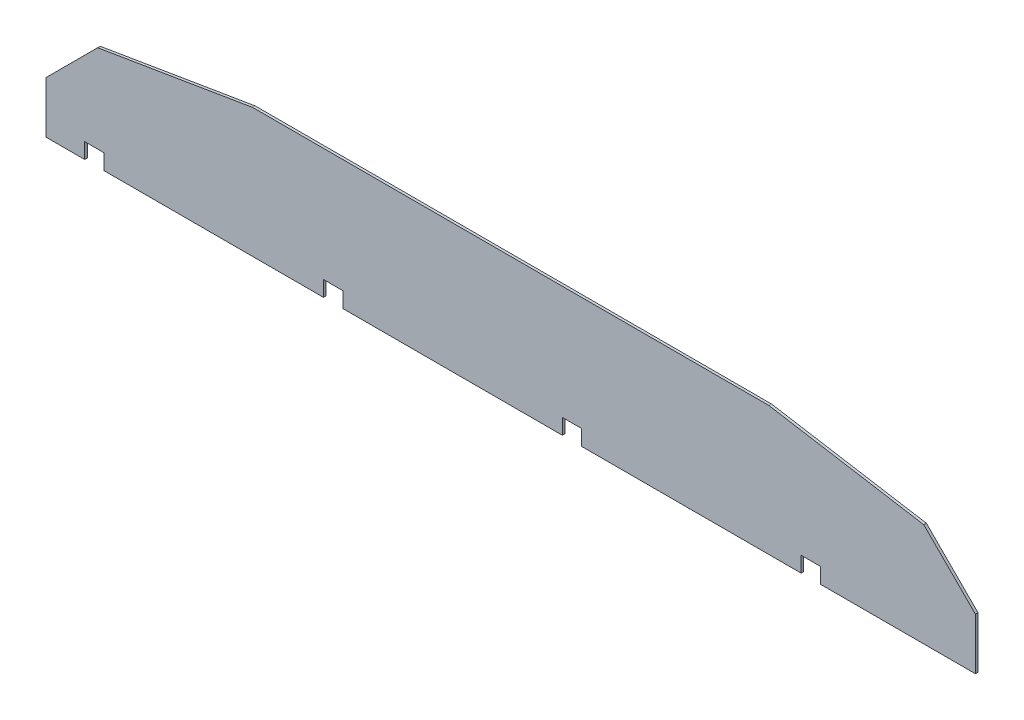
ISO-10303-21;
HEADER;
FILE_DESCRIPTION(('STEP AP214'),'2;1');
FILE_NAME('part.step','',(''),(''),'','','');
FILE_SCHEMA(('AUTOMOTIVE_DESIGN { 1 0 10303 214 1 1 1 1 }'));
ENDSEC;
DATA;
#1=APPLICATION_CONTEXT('core data for automotive mechanical design processes');
#2=APPLICATION_PROTOCOL_DEFINITION('international standard','automotive_design',2000,#1);
#3=PRODUCT_CONTEXT('',#1,'mechanical');
#4=PRODUCT('Part','Part','',(#3));
#5=PRODUCT_RELATED_PRODUCT_CATEGORY('part','',(#4));
#6=PRODUCT_DEFINITION_FORMATION('','',#4);
#7=PRODUCT_DEFINITION_CONTEXT('part definition',#1,'design');
#8=PRODUCT_DEFINITION('design','',#6,#7);
#9=PRODUCT_DEFINITION_SHAPE('','',#8);
#10=(LENGTH_UNIT() NAMED_UNIT(*) SI_UNIT(.MILLI.,.METRE.));
#11=(NAMED_UNIT(*) PLANE_ANGLE_UNIT() SI_UNIT($,.RADIAN.));
#12=(NAMED_UNIT(*) SI_UNIT($,.STERADIAN.) SOLID_ANGLE_UNIT());
#13=UNCERTAINTY_MEASURE_WITH_UNIT(LENGTH_MEASURE(1.E-05),#10,'distance_accuracy_value','');
#14=(GEOMETRIC_REPRESENTATION_CONTEXT(3) GLOBAL_UNCERTAINTY_ASSIGNED_CONTEXT((#13)) GLOBAL_UNIT_ASSIGNED_CONTEXT((#10,
#11,#12)) REPRESENTATION_CONTEXT('',''));
#15=CARTESIAN_POINT('',(0.,0.,0.));
#16=DIRECTION('',(0.,0.,1.));
#17=DIRECTION('',(1.,0.,0.));
#18=AXIS2_PLACEMENT_3D('',#15,#16,#17);
#19=CARTESIAN_POINT('',(-720.,40.,2.));
#20=DIRECTION('',(1.,0.,0.));
#21=DIRECTION('',(0.,0.,-1.));
#22=AXIS2_PLACEMENT_3D('',#19,#20,#21);
#23=PLANE('',#22);
#24=DIRECTION('',(0.,-1.,0.));
#25=VECTOR('',#24,1.);
#26=CARTESIAN_POINT('',(-720.,40.,0.));
#27=LINE('',#26,#25);
#28=CARTESIAN_POINT('',(-720.,40.,0.));
#29=VERTEX_POINT('',#28);
#30=CARTESIAN_POINT('',(-720.,0.,0.));
#31=VERTEX_POINT('',#30);
#32=EDGE_CURVE('E229',#29,#31,#27,.T.);
#33=ORIENTED_EDGE('',*,*,#32,.T.);
#34=DIRECTION('',(0.,0.,-1.));
#35=VECTOR('',#34,1.);
#36=CARTESIAN_POINT('',(-720.,0.,2.));
#37=LINE('',#36,#35);
#38=CARTESIAN_POINT('',(-720.,0.,2.));
#39=VERTEX_POINT('',#38);
#40=EDGE_CURVE('E11',#39,#31,#37,.T.);
#41=ORIENTED_EDGE('',*,*,#40,.F.);
#42=DIRECTION('',(0.,-1.,0.));
#43=VECTOR('',#42,1.);
#44=CARTESIAN_POINT('',(-720.,40.,2.));
#45=LINE('',#44,#43);
#46=CARTESIAN_POINT('',(-720.,40.,2.));
#47=VERTEX_POINT('',#46);
#48=EDGE_CURVE('E275',#47,#39,#45,.T.);
#49=ORIENTED_EDGE('',*,*,#48,.F.);
#50=DIRECTION('',(0.,0.,-1.));
#51=VECTOR('',#50,1.);
#52=CARTESIAN_POINT('',(-720.,40.,2.));
#53=LINE('',#52,#51);
#54=EDGE_CURVE('E225',#47,#29,#53,.T.);
#55=ORIENTED_EDGE('',*,*,#54,.T.);
#56=EDGE_LOOP('',(#33,#41,#49,#55));
#57=FACE_BOUND('',#56,.T.);
#58=ADVANCED_FACE('F37',(#57),#23,.F.);
#59=CARTESIAN_POINT('',(-720.,0.,2.));
#60=DIRECTION('',(0.,1.,0.));
#61=DIRECTION('',(-1.,0.,0.));
#62=AXIS2_PLACEMENT_3D('',#59,#60,#61);
#63=PLANE('',#62);
#64=DIRECTION('',(1.,0.,0.));
#65=VECTOR('',#64,1.);
#66=CARTESIAN_POINT('',(-720.,0.,0.));
#67=LINE('',#66,#65);
#68=CARTESIAN_POINT('',(-690.,0.,0.));
#69=VERTEX_POINT('',#68);
#70=EDGE_CURVE('E232',#31,#69,#67,.T.);
#71=ORIENTED_EDGE('',*,*,#70,.T.);
#72=DIRECTION('',(0.,0.,-1.));
#73=VECTOR('',#72,1.);
#74=CARTESIAN_POINT('',(-690.,0.,2.));
#75=LINE('',#74,#73);
#76=CARTESIAN_POINT('',(-690.,0.,2.));
#77=VERTEX_POINT('',#76);
#78=EDGE_CURVE('E45',#77,#69,#75,.T.);
#79=ORIENTED_EDGE('',*,*,#78,.F.);
#80=DIRECTION('',(1.,0.,0.));
#81=VECTOR('',#80,1.);
#82=CARTESIAN_POINT('',(-720.,0.,2.));
#83=LINE('',#82,#81);
#84=EDGE_CURVE('E144',#39,#77,#83,.T.);
#85=ORIENTED_EDGE('',*,*,#84,.F.);
#86=ORIENTED_EDGE('',*,*,#40,.T.);
#87=EDGE_LOOP('',(#71,#79,#85,#86));
#88=FACE_BOUND('',#87,.T.);
#89=ADVANCED_FACE('F413',(#88),#63,.F.);
#90=CARTESIAN_POINT('',(-690.,0.,2.));
#91=DIRECTION('',(-1.,0.,0.));
#92=DIRECTION('',(0.,0.,1.));
#93=AXIS2_PLACEMENT_3D('',#90,#91,#92);
#94=PLANE('',#93);
#95=DIRECTION('',(0.,1.,0.));
#96=VECTOR('',#95,1.);
#97=CARTESIAN_POINT('',(-690.,0.,0.));
#98=LINE('',#97,#96);
#99=CARTESIAN_POINT('',(-690.,12.,0.));
#100=VERTEX_POINT('',#99);
#101=EDGE_CURVE('E234',#69,#100,#98,.T.);
#102=ORIENTED_EDGE('',*,*,#101,.T.);
#103=DIRECTION('',(0.,0.,-1.));
#104=VECTOR('',#103,1.);
#105=CARTESIAN_POINT('',(-690.,12.,2.));
#106=LINE('',#105,#104);
#107=CARTESIAN_POINT('',(-690.,12.,2.));
#108=VERTEX_POINT('',#107);
#109=EDGE_CURVE('E330',#108,#100,#106,.T.);
#110=ORIENTED_EDGE('',*,*,#109,.F.);
#111=DIRECTION('',(0.,1.,0.));
#112=VECTOR('',#111,1.);
#113=CARTESIAN_POINT('',(-690.,0.,2.));
#114=LINE('',#113,#112);
#115=EDGE_CURVE('E338',#77,#108,#114,.T.);
#116=ORIENTED_EDGE('',*,*,#115,.F.);
#117=ORIENTED_EDGE('',*,*,#78,.T.);
#118=EDGE_LOOP('',(#102,#110,#116,#117));
#119=FACE_BOUND('',#118,.T.);
#120=ADVANCED_FACE('F336',(#119),#94,.F.);
#121=CARTESIAN_POINT('',(-690.,12.,2.));
#122=DIRECTION('',(0.,1.,0.));
#123=DIRECTION('',(-1.,0.,0.));
#124=AXIS2_PLACEMENT_3D('',#121,#122,#123);
#125=PLANE('',#124);
#126=DIRECTION('',(1.,0.,0.));
#127=VECTOR('',#126,1.);
#128=CARTESIAN_POINT('',(-690.,12.,0.));
#129=LINE('',#128,#127);
#130=CARTESIAN_POINT('',(-675.,12.,0.));
#131=VERTEX_POINT('',#130);
#132=EDGE_CURVE('E236',#100,#131,#129,.T.);
#133=ORIENTED_EDGE('',*,*,#132,.T.);
#134=DIRECTION('',(0.,0.,-1.));
#135=VECTOR('',#134,1.);
#136=CARTESIAN_POINT('',(-675.,12.,2.));
#137=LINE('',#136,#135);
#138=CARTESIAN_POINT('',(-675.,12.,2.));
#139=VERTEX_POINT('',#138);
#140=EDGE_CURVE('E327',#139,#131,#137,.T.);
#141=ORIENTED_EDGE('',*,*,#140,.F.);
#142=DIRECTION('',(1.,0.,0.));
#143=VECTOR('',#142,1.);
#144=CARTESIAN_POINT('',(-690.,12.,2.));
#145=LINE('',#144,#143);
#146=EDGE_CURVE('E356',#108,#139,#145,.T.);
#147=ORIENTED_EDGE('',*,*,#146,.F.);
#148=ORIENTED_EDGE('',*,*,#109,.T.);
#149=EDGE_LOOP('',(#133,#141,#147,#148));
#150=FACE_BOUND('',#149,.T.);
#151=ADVANCED_FACE('F347',(#150),#125,.F.);
#152=CARTESIAN_POINT('',(-675.,12.,2.));
#153=DIRECTION('',(1.,0.,0.));
#154=DIRECTION('',(0.,0.,-1.));
#155=AXIS2_PLACEMENT_3D('',#152,#153,#154);
#156=PLANE('',#155);
#157=DIRECTION('',(0.,-1.,0.));
#158=VECTOR('',#157,1.);
#159=CARTESIAN_POINT('',(-675.,12.,0.));
#160=LINE('',#159,#158);
#161=CARTESIAN_POINT('',(-675.,0.,0.));
#162=VERTEX_POINT('',#161);
#163=EDGE_CURVE('E238',#131,#162,#160,.T.);
#164=ORIENTED_EDGE('',*,*,#163,.T.);
#165=DIRECTION('',(0.,0.,-1.));
#166=VECTOR('',#165,1.);
#167=CARTESIAN_POINT('',(-675.,0.,2.));
#168=LINE('',#167,#166);
#169=CARTESIAN_POINT('',(-675.,0.,2.));
#170=VERTEX_POINT('',#169);
#171=EDGE_CURVE('E324',#170,#162,#168,.T.);
#172=ORIENTED_EDGE('',*,*,#171,.F.);
#173=DIRECTION('',(0.,-1.,0.));
#174=VECTOR('',#173,1.);
#175=CARTESIAN_POINT('',(-675.,12.,2.));
#176=LINE('',#175,#174);
#177=EDGE_CURVE('E353',#139,#170,#176,.T.);
#178=ORIENTED_EDGE('',*,*,#177,.F.);
#179=ORIENTED_EDGE('',*,*,#140,.T.);
#180=EDGE_LOOP('',(#164,#172,#178,#179));
#181=FACE_BOUND('',#180,.T.);
#182=ADVANCED_FACE('F351',(#181),#156,.F.);
#183=CARTESIAN_POINT('',(-675.,0.,2.));
#184=DIRECTION('',(0.,1.,0.));
#185=DIRECTION('',(-1.,0.,0.));
#186=AXIS2_PLACEMENT_3D('',#183,#184,#185);
#187=PLANE('',#186);
#188=DIRECTION('',(1.,0.,0.));
#189=VECTOR('',#188,1.);
#190=CARTESIAN_POINT('',(-675.,0.,0.));
#191=LINE('',#190,#189);
#192=CARTESIAN_POINT('',(-505.,0.,0.));
#193=VERTEX_POINT('',#192);
#194=EDGE_CURVE('E240',#162,#193,#191,.T.);
#195=ORIENTED_EDGE('',*,*,#194,.T.);
#196=DIRECTION('',(0.,0.,-1.));
#197=VECTOR('',#196,1.);
#198=CARTESIAN_POINT('',(-505.,0.,2.));
#199=LINE('',#198,#197);
#200=CARTESIAN_POINT('',(-505.,0.,2.));
#201=VERTEX_POINT('',#200);
#202=EDGE_CURVE('E321',#201,#193,#199,.T.);
#203=ORIENTED_EDGE('',*,*,#202,.F.);
#204=DIRECTION('',(1.,0.,0.));
#205=VECTOR('',#204,1.);
#206=CARTESIAN_POINT('',(-675.,0.,2.));
#207=LINE('',#206,#205);
#208=EDGE_CURVE('E355',#170,#201,#207,.T.);
#209=ORIENTED_EDGE('',*,*,#208,.F.);
#210=ORIENTED_EDGE('',*,*,#171,.T.);
#211=EDGE_LOOP('',(#195,#203,#209,#210));
#212=FACE_BOUND('',#211,.T.);
#213=ADVANCED_FACE('F426',(#212),#187,.F.);
#214=CARTESIAN_POINT('',(-505.,0.,2.));
#215=DIRECTION('',(-1.,0.,0.));
#216=DIRECTION('',(0.,0.,1.));
#217=AXIS2_PLACEMENT_3D('',#214,#215,#216);
#218=PLANE('',#217);
#219=DIRECTION('',(0.,1.,0.));
#220=VECTOR('',#219,1.);
#221=CARTESIAN_POINT('',(-505.,0.,0.));
#222=LINE('',#221,#220);
#223=CARTESIAN_POINT('',(-505.,12.,0.));
#224=VERTEX_POINT('',#223);
#225=EDGE_CURVE('E242',#193,#224,#222,.T.);
#226=ORIENTED_EDGE('',*,*,#225,.T.);
#227=DIRECTION('',(0.,0.,-1.));
#228=VECTOR('',#227,1.);
#229=CARTESIAN_POINT('',(-505.,12.,2.));
#230=LINE('',#229,#228);
#231=CARTESIAN_POINT('',(-505.,12.,2.));
#232=VERTEX_POINT('',#231);
#233=EDGE_CURVE('E318',#232,#224,#230,.T.);
#234=ORIENTED_EDGE('',*,*,#233,.F.);
#235=DIRECTION('',(0.,1.,0.));
#236=VECTOR('',#235,1.);
#237=CARTESIAN_POINT('',(-505.,0.,2.));
#238=LINE('',#237,#236);
#239=EDGE_CURVE('E358',#201,#232,#238,.T.);
#240=ORIENTED_EDGE('',*,*,#239,.F.);
#241=ORIENTED_EDGE('',*,*,#202,.T.);
#242=EDGE_LOOP('',(#226,#234,#240,#241));
#243=FACE_BOUND('',#242,.T.);
#244=ADVANCED_FACE('F429',(#243),#218,.F.);
#245=CARTESIAN_POINT('',(-505.,12.,2.));
#246=DIRECTION('',(0.,1.,0.));
#247=DIRECTION('',(-1.,0.,0.));
#248=AXIS2_PLACEMENT_3D('',#245,#246,#247);
#249=PLANE('',#248);
#250=DIRECTION('',(1.,0.,0.));
#251=VECTOR('',#250,1.);
#252=CARTESIAN_POINT('',(-505.,12.,0.));
#253=LINE('',#252,#251);
#254=CARTESIAN_POINT('',(-490.,12.,0.));
#255=VERTEX_POINT('',#254);
#256=EDGE_CURVE('E244',#224,#255,#253,.T.);
#257=ORIENTED_EDGE('',*,*,#256,.T.);
#258=DIRECTION('',(0.,0.,-1.));
#259=VECTOR('',#258,1.);
#260=CARTESIAN_POINT('',(-490.,12.,2.));
#261=LINE('',#260,#259);
#262=CARTESIAN_POINT('',(-490.,12.,2.));
#263=VERTEX_POINT('',#262);
#264=EDGE_CURVE('E315',#263,#255,#261,.T.);
#265=ORIENTED_EDGE('',*,*,#264,.F.);
#266=DIRECTION('',(1.,0.,0.));
#267=VECTOR('',#266,1.);
#268=CARTESIAN_POINT('',(-505.,12.,2.));
#269=LINE('',#268,#267);
#270=EDGE_CURVE('E364',#232,#263,#269,.T.);
#271=ORIENTED_EDGE('',*,*,#270,.F.);
#272=ORIENTED_EDGE('',*,*,#233,.T.);
#273=EDGE_LOOP('',(#257,#265,#271,#272));
#274=FACE_BOUND('',#273,.T.);
#275=ADVANCED_FACE('F433',(#274),#249,.F.);
#276=CARTESIAN_POINT('',(-490.,12.,2.));
#277=DIRECTION('',(1.,0.,0.));
#278=DIRECTION('',(0.,0.,-1.));
#279=AXIS2_PLACEMENT_3D('',#276,#277,#278);
#280=PLANE('',#279);
#281=DIRECTION('',(0.,-1.,0.));
#282=VECTOR('',#281,1.);
#283=CARTESIAN_POINT('',(-490.,12.,0.));
#284=LINE('',#283,#282);
#285=CARTESIAN_POINT('',(-490.,0.,0.));
#286=VERTEX_POINT('',#285);
#287=EDGE_CURVE('E246',#255,#286,#284,.T.);
#288=ORIENTED_EDGE('',*,*,#287,.T.);
#289=DIRECTION('',(0.,0.,-1.));
#290=VECTOR('',#289,1.);
#291=CARTESIAN_POINT('',(-490.,0.,2.));
#292=LINE('',#291,#290);
#293=CARTESIAN_POINT('',(-490.,0.,2.));
#294=VERTEX_POINT('',#293);
#295=EDGE_CURVE('E312',#294,#286,#292,.T.);
#296=ORIENTED_EDGE('',*,*,#295,.F.);
#297=DIRECTION('',(0.,-1.,0.));
#298=VECTOR('',#297,1.);
#299=CARTESIAN_POINT('',(-490.,12.,2.));
#300=LINE('',#299,#298);
#301=EDGE_CURVE('E366',#263,#294,#300,.T.);
#302=ORIENTED_EDGE('',*,*,#301,.F.);
#303=ORIENTED_EDGE('',*,*,#264,.T.);
#304=EDGE_LOOP('',(#288,#296,#302,#303));
#305=FACE_BOUND('',#304,.T.);
#306=ADVANCED_FACE('F437',(#305),#280,.F.);
#307=CARTESIAN_POINT('',(-490.,0.,2.));
#308=DIRECTION('',(0.,1.,0.));
#309=DIRECTION('',(-1.,0.,0.));
#310=AXIS2_PLACEMENT_3D('',#307,#308,#309);
#311=PLANE('',#310);
#312=DIRECTION('',(1.,0.,0.));
#313=VECTOR('',#312,1.);
#314=CARTESIAN_POINT('',(-490.,0.,0.));
#315=LINE('',#314,#313);
#316=CARTESIAN_POINT('',(-320.,0.,0.));
#317=VERTEX_POINT('',#316);
#318=EDGE_CURVE('E248',#286,#317,#315,.T.);
#319=ORIENTED_EDGE('',*,*,#318,.T.);
#320=DIRECTION('',(0.,0.,-1.));
#321=VECTOR('',#320,1.);
#322=CARTESIAN_POINT('',(-320.,0.,2.));
#323=LINE('',#322,#321);
#324=CARTESIAN_POINT('',(-320.,0.,2.));
#325=VERTEX_POINT('',#324);
#326=EDGE_CURVE('E309',#325,#317,#323,.T.);
#327=ORIENTED_EDGE('',*,*,#326,.F.);
#328=DIRECTION('',(1.,0.,0.));
#329=VECTOR('',#328,1.);
#330=CARTESIAN_POINT('',(-490.,0.,2.));
#331=LINE('',#330,#329);
#332=EDGE_CURVE('E368',#294,#325,#331,.T.);
#333=ORIENTED_EDGE('',*,*,#332,.F.);
#334=ORIENTED_EDGE('',*,*,#295,.T.);
#335=EDGE_LOOP('',(#319,#327,#333,#334));
#336=FACE_BOUND('',#335,.T.);
#337=ADVANCED_FACE('F441',(#336),#311,.F.);
#338=CARTESIAN_POINT('',(-320.,0.,2.));
#339=DIRECTION('',(-1.,0.,0.));
#340=DIRECTION('',(0.,0.,1.));
#341=AXIS2_PLACEMENT_3D('',#338,#339,#340);
#342=PLANE('',#341);
#343=DIRECTION('',(0.,1.,0.));
#344=VECTOR('',#343,1.);
#345=CARTESIAN_POINT('',(-320.,0.,0.));
#346=LINE('',#345,#344);
#347=CARTESIAN_POINT('',(-320.,12.,0.));
#348=VERTEX_POINT('',#347);
#349=EDGE_CURVE('E250',#317,#348,#346,.T.);
#350=ORIENTED_EDGE('',*,*,#349,.T.);
#351=DIRECTION('',(0.,0.,-1.));
#352=VECTOR('',#351,1.);
#353=CARTESIAN_POINT('',(-320.,12.,2.));
#354=LINE('',#353,#352);
#355=CARTESIAN_POINT('',(-320.,12.,2.));
#356=VERTEX_POINT('',#355);
#357=EDGE_CURVE('E306',#356,#348,#354,.T.);
#358=ORIENTED_EDGE('',*,*,#357,.F.);
#359=DIRECTION('',(0.,1.,0.));
#360=VECTOR('',#359,1.);
#361=CARTESIAN_POINT('',(-320.,0.,2.));
#362=LINE('',#361,#360);
#363=EDGE_CURVE('E370',#325,#356,#362,.T.);
#364=ORIENTED_EDGE('',*,*,#363,.F.);
#365=ORIENTED_EDGE('',*,*,#326,.T.);
#366=EDGE_LOOP('',(#350,#358,#364,#365));
#367=FACE_BOUND('',#366,.T.);
#368=ADVANCED_FACE('F445',(#367),#342,.F.);
#369=CARTESIAN_POINT('',(-320.,12.,2.));
#370=DIRECTION('',(0.,1.,0.));
#371=DIRECTION('',(-1.,0.,0.));
#372=AXIS2_PLACEMENT_3D('',#369,#370,#371);
#373=PLANE('',#372);
#374=DIRECTION('',(1.,0.,0.));
#375=VECTOR('',#374,1.);
#376=CARTESIAN_POINT('',(-320.,12.,0.));
#377=LINE('',#376,#375);
#378=CARTESIAN_POINT('',(-305.,12.,0.));
#379=VERTEX_POINT('',#378);
#380=EDGE_CURVE('E252',#348,#379,#377,.T.);
#381=ORIENTED_EDGE('',*,*,#380,.T.);
#382=DIRECTION('',(0.,0.,-1.));
#383=VECTOR('',#382,1.);
#384=CARTESIAN_POINT('',(-305.,12.,2.));
#385=LINE('',#384,#383);
#386=CARTESIAN_POINT('',(-305.,12.,2.));
#387=VERTEX_POINT('',#386);
#388=EDGE_CURVE('E303',#387,#379,#385,.T.);
#389=ORIENTED_EDGE('',*,*,#388,.F.);
#390=DIRECTION('',(1.,0.,0.));
#391=VECTOR('',#390,1.);
#392=CARTESIAN_POINT('',(-320.,12.,2.));
#393=LINE('',#392,#391);
#394=EDGE_CURVE('E372',#356,#387,#393,.T.);
#395=ORIENTED_EDGE('',*,*,#394,.F.);
#396=ORIENTED_EDGE('',*,*,#357,.T.);
#397=EDGE_LOOP('',(#381,#389,#395,#396));
#398=FACE_BOUND('',#397,.T.);
#399=ADVANCED_FACE('F449',(#398),#373,.F.);
#400=CARTESIAN_POINT('',(-305.,12.,2.));
#401=DIRECTION('',(1.,0.,0.));
#402=DIRECTION('',(0.,0.,-1.));
#403=AXIS2_PLACEMENT_3D('',#400,#401,#402);
#404=PLANE('',#403);
#405=DIRECTION('',(0.,-1.,0.));
#406=VECTOR('',#405,1.);
#407=CARTESIAN_POINT('',(-305.,12.,0.));
#408=LINE('',#407,#406);
#409=CARTESIAN_POINT('',(-305.,0.,0.));
#410=VERTEX_POINT('',#409);
#411=EDGE_CURVE('E254',#379,#410,#408,.T.);
#412=ORIENTED_EDGE('',*,*,#411,.T.);
#413=DIRECTION('',(0.,0.,-1.));
#414=VECTOR('',#413,1.);
#415=CARTESIAN_POINT('',(-305.,0.,2.));
#416=LINE('',#415,#414);
#417=CARTESIAN_POINT('',(-305.,0.,2.));
#418=VERTEX_POINT('',#417);
#419=EDGE_CURVE('E300',#418,#410,#416,.T.);
#420=ORIENTED_EDGE('',*,*,#419,.F.);
#421=DIRECTION('',(0.,-1.,0.));
#422=VECTOR('',#421,1.);
#423=CARTESIAN_POINT('',(-305.,12.,2.));
#424=LINE('',#423,#422);
#425=EDGE_CURVE('E374',#387,#418,#424,.T.);
#426=ORIENTED_EDGE('',*,*,#425,.F.);
#427=ORIENTED_EDGE('',*,*,#388,.T.);
#428=EDGE_LOOP('',(#412,#420,#426,#427));
#429=FACE_BOUND('',#428,.T.);
#430=ADVANCED_FACE('F453',(#429),#404,.F.);
#431=CARTESIAN_POINT('',(-305.,0.,2.));
#432=DIRECTION('',(0.,1.,0.));
#433=DIRECTION('',(-1.,0.,0.));
#434=AXIS2_PLACEMENT_3D('',#431,#432,#433);
#435=PLANE('',#434);
#436=DIRECTION('',(1.,0.,0.));
#437=VECTOR('',#436,1.);
#438=CARTESIAN_POINT('',(-305.,0.,0.));
#439=LINE('',#438,#437);
#440=CARTESIAN_POINT('',(-135.,0.,0.));
#441=VERTEX_POINT('',#440);
#442=EDGE_CURVE('E256',#410,#441,#439,.T.);
#443=ORIENTED_EDGE('',*,*,#442,.T.);
#444=DIRECTION('',(0.,0.,-1.));
#445=VECTOR('',#444,1.);
#446=CARTESIAN_POINT('',(-135.,0.,2.));
#447=LINE('',#446,#445);
#448=CARTESIAN_POINT('',(-135.,0.,2.));
#449=VERTEX_POINT('',#448);
#450=EDGE_CURVE('E297',#449,#441,#447,.T.);
#451=ORIENTED_EDGE('',*,*,#450,.F.);
#452=DIRECTION('',(1.,0.,0.));
#453=VECTOR('',#452,1.);
#454=CARTESIAN_POINT('',(-305.,0.,2.));
#455=LINE('',#454,#453);
#456=EDGE_CURVE('E376',#418,#449,#455,.T.);
#457=ORIENTED_EDGE('',*,*,#456,.F.);
#458=ORIENTED_EDGE('',*,*,#419,.T.);
#459=EDGE_LOOP('',(#443,#451,#457,#458));
#460=FACE_BOUND('',#459,.T.);
#461=ADVANCED_FACE('F457',(#460),#435,.F.);
#462=CARTESIAN_POINT('',(-135.,0.,2.));
#463=DIRECTION('',(-1.,0.,0.));
#464=DIRECTION('',(0.,0.,1.));
#465=AXIS2_PLACEMENT_3D('',#462,#463,#464);
#466=PLANE('',#465);
#467=DIRECTION('',(0.,1.,0.));
#468=VECTOR('',#467,1.);
#469=CARTESIAN_POINT('',(-135.,0.,0.));
#470=LINE('',#469,#468);
#471=CARTESIAN_POINT('',(-135.,12.,0.));
#472=VERTEX_POINT('',#471);
#473=EDGE_CURVE('E258',#441,#472,#470,.T.);
#474=ORIENTED_EDGE('',*,*,#473,.T.);
#475=DIRECTION('',(0.,0.,-1.));
#476=VECTOR('',#475,1.);
#477=CARTESIAN_POINT('',(-135.,12.,2.));
#478=LINE('',#477,#476);
#479=CARTESIAN_POINT('',(-135.,12.,2.));
#480=VERTEX_POINT('',#479);
#481=EDGE_CURVE('E294',#480,#472,#478,.T.);
#482=ORIENTED_EDGE('',*,*,#481,.F.);
#483=DIRECTION('',(0.,1.,0.));
#484=VECTOR('',#483,1.);
#485=CARTESIAN_POINT('',(-135.,0.,2.));
#486=LINE('',#485,#484);
#487=EDGE_CURVE('E378',#449,#480,#486,.T.);
#488=ORIENTED_EDGE('',*,*,#487,.F.);
#489=ORIENTED_EDGE('',*,*,#450,.T.);
#490=EDGE_LOOP('',(#474,#482,#488,#489));
#491=FACE_BOUND('',#490,.T.);
#492=ADVANCED_FACE('F461',(#491),#466,.F.);
#493=CARTESIAN_POINT('',(-135.,12.,2.));
#494=DIRECTION('',(0.,1.,0.));
#495=DIRECTION('',(-1.,0.,0.));
#496=AXIS2_PLACEMENT_3D('',#493,#494,#495);
#497=PLANE('',#496);
#498=DIRECTION('',(1.,0.,0.));
#499=VECTOR('',#498,1.);
#500=CARTESIAN_POINT('',(-135.,12.,0.));
#501=LINE('',#500,#499);
#502=CARTESIAN_POINT('',(-120.,12.,0.));
#503=VERTEX_POINT('',#502);
#504=EDGE_CURVE('E260',#472,#503,#501,.T.);
#505=ORIENTED_EDGE('',*,*,#504,.T.);
#506=DIRECTION('',(0.,0.,-1.));
#507=VECTOR('',#506,1.);
#508=CARTESIAN_POINT('',(-120.,12.,2.));
#509=LINE('',#508,#507);
#510=CARTESIAN_POINT('',(-120.,12.,2.));
#511=VERTEX_POINT('',#510);
#512=EDGE_CURVE('E291',#511,#503,#509,.T.);
#513=ORIENTED_EDGE('',*,*,#512,.F.);
#514=DIRECTION('',(1.,0.,0.));
#515=VECTOR('',#514,1.);
#516=CARTESIAN_POINT('',(-135.,12.,2.));
#517=LINE('',#516,#515);
#518=EDGE_CURVE('E380',#480,#511,#517,.T.);
#519=ORIENTED_EDGE('',*,*,#518,.F.);
#520=ORIENTED_EDGE('',*,*,#481,.T.);
#521=EDGE_LOOP('',(#505,#513,#519,#520));
#522=FACE_BOUND('',#521,.T.);
#523=ADVANCED_FACE('F465',(#522),#497,.F.);
#524=CARTESIAN_POINT('',(-120.,12.,2.));
#525=DIRECTION('',(1.,0.,0.));
#526=DIRECTION('',(0.,0.,-1.));
#527=AXIS2_PLACEMENT_3D('',#524,#525,#526);
#528=PLANE('',#527);
#529=DIRECTION('',(0.,-1.,0.));
#530=VECTOR('',#529,1.);
#531=CARTESIAN_POINT('',(-120.,12.,0.));
#532=LINE('',#531,#530);
#533=CARTESIAN_POINT('',(-120.,0.,0.));
#534=VERTEX_POINT('',#533);
#535=EDGE_CURVE('E262',#503,#534,#532,.T.);
#536=ORIENTED_EDGE('',*,*,#535,.T.);
#537=DIRECTION('',(0.,0.,-1.));
#538=VECTOR('',#537,1.);
#539=CARTESIAN_POINT('',(-120.,0.,2.));
#540=LINE('',#539,#538);
#541=CARTESIAN_POINT('',(-120.,0.,2.));
#542=VERTEX_POINT('',#541);
#543=EDGE_CURVE('E288',#542,#534,#540,.T.);
#544=ORIENTED_EDGE('',*,*,#543,.F.);
#545=DIRECTION('',(0.,-1.,0.));
#546=VECTOR('',#545,1.);
#547=CARTESIAN_POINT('',(-120.,12.,2.));
#548=LINE('',#547,#546);
#549=EDGE_CURVE('E382',#511,#542,#548,.T.);
#550=ORIENTED_EDGE('',*,*,#549,.F.);
#551=ORIENTED_EDGE('',*,*,#512,.T.);
#552=EDGE_LOOP('',(#536,#544,#550,#551));
#553=FACE_BOUND('',#552,.T.);
#554=ADVANCED_FACE('F469',(#553),#528,.F.);
#555=CARTESIAN_POINT('',(-120.,0.,2.));
#556=DIRECTION('',(0.,1.,0.));
#557=DIRECTION('',(0.,0.,1.));
#558=AXIS2_PLACEMENT_3D('',#555,#556,#557);
#559=PLANE('',#558);
#560=DIRECTION('',(1.,0.,0.));
#561=VECTOR('',#560,1.);
#562=CARTESIAN_POINT('',(-120.,0.,0.));
#563=LINE('',#562,#561);
#564=CARTESIAN_POINT('',(0.,0.,0.));
#565=VERTEX_POINT('',#564);
#566=EDGE_CURVE('E264',#534,#565,#563,.T.);
#567=ORIENTED_EDGE('',*,*,#566,.T.);
#568=DIRECTION('',(0.,0.,-1.));
#569=VECTOR('',#568,1.);
#570=CARTESIAN_POINT('',(0.,0.,2.));
#571=LINE('',#570,#569);
#572=CARTESIAN_POINT('',(0.,0.,2.));
#573=VERTEX_POINT('',#572);
#574=EDGE_CURVE('E285',#573,#565,#571,.T.);
#575=ORIENTED_EDGE('',*,*,#574,.F.);
#576=DIRECTION('',(1.,0.,0.));
#577=VECTOR('',#576,1.);
#578=CARTESIAN_POINT('',(-120.,0.,2.));
#579=LINE('',#578,#577);
#580=EDGE_CURVE('E384',#542,#573,#579,.T.);
#581=ORIENTED_EDGE('',*,*,#580,.F.);
#582=ORIENTED_EDGE('',*,*,#543,.T.);
#583=EDGE_LOOP('',(#567,#575,#581,#582));
#584=FACE_BOUND('',#583,.T.);
#585=ADVANCED_FACE('F473',(#584),#559,.F.);
#586=CARTESIAN_POINT('',(0.,0.,2.));
#587=DIRECTION('',(-1.,0.,0.));
#588=DIRECTION('',(0.,0.,1.));
#589=AXIS2_PLACEMENT_3D('',#586,#587,#588);
#590=PLANE('',#589);
#591=DIRECTION('',(0.,1.,0.));
#592=VECTOR('',#591,1.);
#593=CARTESIAN_POINT('',(0.,0.,0.));
#594=LINE('',#593,#592);
#595=CARTESIAN_POINT('',(0.,40.,0.));
#596=VERTEX_POINT('',#595);
#597=EDGE_CURVE('E266',#565,#596,#594,.T.);
#598=ORIENTED_EDGE('',*,*,#597,.T.);
#599=DIRECTION('',(0.,0.,-1.));
#600=VECTOR('',#599,1.);
#601=CARTESIAN_POINT('',(0.,40.,2.));
#602=LINE('',#601,#600);
#603=CARTESIAN_POINT('',(0.,40.,2.));
#604=VERTEX_POINT('',#603);
#605=EDGE_CURVE('E282',#604,#596,#602,.T.);
#606=ORIENTED_EDGE('',*,*,#605,.F.);
#607=DIRECTION('',(0.,1.,0.));
#608=VECTOR('',#607,1.);
#609=CARTESIAN_POINT('',(0.,0.,2.));
#610=LINE('',#609,#608);
#611=EDGE_CURVE('E386',#573,#604,#610,.T.);
#612=ORIENTED_EDGE('',*,*,#611,.F.);
#613=ORIENTED_EDGE('',*,*,#574,.T.);
#614=EDGE_LOOP('',(#598,#606,#612,#613));
#615=FACE_BOUND('',#614,.T.);
#616=ADVANCED_FACE('F477',(#615),#590,.F.);
#617=CARTESIAN_POINT('',(0.,40.,2.));
#618=DIRECTION('',(-0.707106781186547,-0.707106781186548,0.));
#619=DIRECTION('',(0.707106781186548,-0.707106781186547,0.));
#620=AXIS2_PLACEMENT_3D('',#617,#618,#619);
#621=PLANE('',#620);
#622=DIRECTION('',(-0.707106781186548,0.707106781186547,0.));
#623=VECTOR('',#622,1.);
#624=CARTESIAN_POINT('',(0.,40.,0.));
#625=LINE('',#624,#623);
#626=CARTESIAN_POINT('',(-39.9999999999999,79.9999999999999,0.));
#627=VERTEX_POINT('',#626);
#628=EDGE_CURVE('E268',#596,#627,#625,.T.);
#629=ORIENTED_EDGE('',*,*,#628,.T.);
#630=DIRECTION('',(0.,0.,-1.));
#631=VECTOR('',#630,1.);
#632=CARTESIAN_POINT('',(-39.9999999999999,79.9999999999999,2.));
#633=LINE('',#632,#631);
#634=CARTESIAN_POINT('',(-39.9999999999999,79.9999999999999,2.));
#635=VERTEX_POINT('',#634);
#636=EDGE_CURVE('E279',#635,#627,#633,.T.);
#637=ORIENTED_EDGE('',*,*,#636,.F.);
#638=DIRECTION('',(-0.707106781186548,0.707106781186547,0.));
#639=VECTOR('',#638,1.);
#640=CARTESIAN_POINT('',(0.,40.,2.));
#641=LINE('',#640,#639);
#642=EDGE_CURVE('E388',#604,#635,#641,.T.);
#643=ORIENTED_EDGE('',*,*,#642,.F.);
#644=ORIENTED_EDGE('',*,*,#605,.T.);
#645=EDGE_LOOP('',(#629,#637,#643,#644));
#646=FACE_BOUND('',#645,.T.);
#647=ADVANCED_FACE('F394',(#646),#621,.F.);
#648=CARTESIAN_POINT('',(-160.,100.,2.));
#649=DIRECTION('',(-0.164398987305358,-0.986393923832144,0.));
#650=DIRECTION('',(0.986393923832144,-0.164398987305358,0.));
#651=AXIS2_PLACEMENT_3D('',#648,#649,#650);
#652=PLANE('',#651);
#653=DIRECTION('',(-0.986393923832144,0.164398987305358,0.));
#654=VECTOR('',#653,1.);
#655=CARTESIAN_POINT('',(-160.,100.,0.));
#656=LINE('',#655,#654);
#657=CARTESIAN_POINT('',(-160.,100.,0.));
#658=VERTEX_POINT('',#657);
#659=EDGE_CURVE('E270',#627,#658,#656,.T.);
#660=ORIENTED_EDGE('',*,*,#659,.T.);
#661=DIRECTION('',(0.,0.,-1.));
#662=VECTOR('',#661,1.);
#663=CARTESIAN_POINT('',(-160.,100.,2.));
#664=LINE('',#663,#662);
#665=CARTESIAN_POINT('',(-160.,100.,2.));
#666=VERTEX_POINT('',#665);
#667=EDGE_CURVE('E220',#666,#658,#664,.T.);
#668=ORIENTED_EDGE('',*,*,#667,.F.);
#669=DIRECTION('',(-0.986393923832144,0.164398987305358,0.));
#670=VECTOR('',#669,1.);
#671=CARTESIAN_POINT('',(-160.,100.,2.));
#672=LINE('',#671,#670);
#673=EDGE_CURVE('E211',#635,#666,#672,.T.);
#674=ORIENTED_EDGE('',*,*,#673,.F.);
#675=ORIENTED_EDGE('',*,*,#636,.T.);
#676=EDGE_LOOP('',(#660,#668,#674,#675));
#677=FACE_BOUND('',#676,.T.);
#678=ADVANCED_FACE('F398',(#677),#652,.F.);
#679=CARTESIAN_POINT('',(-160.,100.,2.));
#680=DIRECTION('',(0.,-1.,0.));
#681=DIRECTION('',(1.,0.,0.));
#682=AXIS2_PLACEMENT_3D('',#679,#680,#681);
#683=PLANE('',#682);
#684=DIRECTION('',(-1.,0.,0.));
#685=VECTOR('',#684,1.);
#686=CARTESIAN_POINT('',(-160.,100.,0.));
#687=LINE('',#686,#685);
#688=CARTESIAN_POINT('',(-560.,99.9999999999999,0.));
#689=VERTEX_POINT('',#688);
#690=EDGE_CURVE('E219',#658,#689,#687,.T.);
#691=ORIENTED_EDGE('',*,*,#690,.T.);
#692=DIRECTION('',(0.,0.,-1.));
#693=VECTOR('',#692,1.);
#694=CARTESIAN_POINT('',(-560.,99.9999999999999,2.));
#695=LINE('',#694,#693);
#696=CARTESIAN_POINT('',(-560.,99.9999999999999,2.));
#697=VERTEX_POINT('',#696);
#698=EDGE_CURVE('E216',#697,#689,#695,.T.);
#699=ORIENTED_EDGE('',*,*,#698,.F.);
#700=DIRECTION('',(-1.,0.,0.));
#701=VECTOR('',#700,1.);
#702=CARTESIAN_POINT('',(-160.,100.,2.));
#703=LINE('',#702,#701);
#704=EDGE_CURVE('E205',#666,#697,#703,.T.);
#705=ORIENTED_EDGE('',*,*,#704,.F.);
#706=ORIENTED_EDGE('',*,*,#667,.T.);
#707=EDGE_LOOP('',(#691,#699,#705,#706));
#708=FACE_BOUND('',#707,.T.);
#709=ADVANCED_FACE('F217',(#708),#683,.F.);
#710=CARTESIAN_POINT('',(-680.,79.9999999999999,2.));
#711=DIRECTION('',(0.164398987305357,-0.986393923832144,0.));
#712=DIRECTION('',(0.986393923832144,0.164398987305357,0.));
#713=AXIS2_PLACEMENT_3D('',#710,#711,#712);
#714=PLANE('',#713);
#715=DIRECTION('',(-0.986393923832144,-0.164398987305357,0.));
#716=VECTOR('',#715,1.);
#717=CARTESIAN_POINT('',(-680.,79.9999999999999,0.));
#718=LINE('',#717,#716);
#719=CARTESIAN_POINT('',(-680.,79.9999999999999,0.));
#720=VERTEX_POINT('',#719);
#721=EDGE_CURVE('E130',#689,#720,#718,.T.);
#722=ORIENTED_EDGE('',*,*,#721,.T.);
#723=DIRECTION('',(0.,0.,-1.));
#724=VECTOR('',#723,1.);
#725=CARTESIAN_POINT('',(-680.,79.9999999999999,2.));
#726=LINE('',#725,#724);
#727=CARTESIAN_POINT('',(-680.,79.9999999999999,2.));
#728=VERTEX_POINT('',#727);
#729=EDGE_CURVE('E221',#728,#720,#726,.T.);
#730=ORIENTED_EDGE('',*,*,#729,.F.);
#731=DIRECTION('',(-0.986393923832144,-0.164398987305357,0.));
#732=VECTOR('',#731,1.);
#733=CARTESIAN_POINT('',(-680.,79.9999999999999,2.));
#734=LINE('',#733,#732);
#735=EDGE_CURVE('E209',#697,#728,#734,.T.);
#736=ORIENTED_EDGE('',*,*,#735,.F.);
#737=ORIENTED_EDGE('',*,*,#698,.T.);
#738=EDGE_LOOP('',(#722,#730,#736,#737));
#739=FACE_BOUND('',#738,.T.);
#740=ADVANCED_FACE('F223',(#739),#714,.F.);
#741=CARTESIAN_POINT('',(-680.,79.9999999999999,2.));
#742=DIRECTION('',(0.707106781186547,-0.707106781186549,0.));
#743=DIRECTION('',(0.707106781186549,0.707106781186547,0.));
#744=AXIS2_PLACEMENT_3D('',#741,#742,#743);
#745=PLANE('',#744);
#746=DIRECTION('',(-0.707106781186549,-0.707106781186547,0.));
#747=VECTOR('',#746,1.);
#748=CARTESIAN_POINT('',(-680.,79.9999999999999,0.));
#749=LINE('',#748,#747);
#750=EDGE_CURVE('E136',#720,#29,#749,.T.);
#751=ORIENTED_EDGE('',*,*,#750,.T.);
#752=ORIENTED_EDGE('',*,*,#54,.F.);
#753=DIRECTION('',(-0.707106781186549,-0.707106781186547,0.));
#754=VECTOR('',#753,1.);
#755=CARTESIAN_POINT('',(-680.,79.9999999999999,2.));
#756=LINE('',#755,#754);
#757=EDGE_CURVE('E53',#728,#47,#756,.T.);
#758=ORIENTED_EDGE('',*,*,#757,.F.);
#759=ORIENTED_EDGE('',*,*,#729,.T.);
#760=EDGE_LOOP('',(#751,#752,#758,#759));
#761=FACE_BOUND('',#760,.T.);
#762=ADVANCED_FACE('F402',(#761),#745,.F.);
#763=CARTESIAN_POINT('',(0.,0.,2.));
#764=DIRECTION('',(0.,0.,1.));
#765=DIRECTION('',(1.,0.,0.));
#766=AXIS2_PLACEMENT_3D('',#763,#764,#765);
#767=PLANE('',#766);
#768=ORIENTED_EDGE('',*,*,#48,.T.);
#769=ORIENTED_EDGE('',*,*,#84,.T.);
#770=ORIENTED_EDGE('',*,*,#115,.T.);
#771=ORIENTED_EDGE('',*,*,#146,.T.);
#772=ORIENTED_EDGE('',*,*,#177,.T.);
#773=ORIENTED_EDGE('',*,*,#208,.T.);
#774=ORIENTED_EDGE('',*,*,#239,.T.);
#775=ORIENTED_EDGE('',*,*,#270,.T.);
#776=ORIENTED_EDGE('',*,*,#301,.T.);
#777=ORIENTED_EDGE('',*,*,#332,.T.);
#778=ORIENTED_EDGE('',*,*,#363,.T.);
#779=ORIENTED_EDGE('',*,*,#394,.T.);
#780=ORIENTED_EDGE('',*,*,#425,.T.);
#781=ORIENTED_EDGE('',*,*,#456,.T.);
#782=ORIENTED_EDGE('',*,*,#487,.T.);
#783=ORIENTED_EDGE('',*,*,#518,.T.);
#784=ORIENTED_EDGE('',*,*,#549,.T.);
#785=ORIENTED_EDGE('',*,*,#580,.T.);
#786=ORIENTED_EDGE('',*,*,#611,.T.);
#787=ORIENTED_EDGE('',*,*,#642,.T.);
#788=ORIENTED_EDGE('',*,*,#673,.T.);
#789=ORIENTED_EDGE('',*,*,#704,.T.);
#790=ORIENTED_EDGE('',*,*,#735,.T.);
#791=ORIENTED_EDGE('',*,*,#757,.T.);
#792=EDGE_LOOP('',(#768,#769,#770,#771,#772,#773,#774,#775,#776,#777,#778,#779,#780,#781,#782,
#783,#784,#785,#786,#787,#788,#789,#790,#791));
#793=FACE_BOUND('',#792,.T.);
#794=ADVANCED_FACE('F207',(#793),#767,.T.);
#795=CARTESIAN_POINT('',(0.,0.,0.));
#796=DIRECTION('',(0.,0.,1.));
#797=DIRECTION('',(1.,0.,0.));
#798=AXIS2_PLACEMENT_3D('',#795,#796,#797);
#799=PLANE('',#798);
#800=ORIENTED_EDGE('',*,*,#32,.F.);
#801=ORIENTED_EDGE('',*,*,#750,.F.);
#802=ORIENTED_EDGE('',*,*,#721,.F.);
#803=ORIENTED_EDGE('',*,*,#690,.F.);
#804=ORIENTED_EDGE('',*,*,#659,.F.);
#805=ORIENTED_EDGE('',*,*,#628,.F.);
#806=ORIENTED_EDGE('',*,*,#597,.F.);
#807=ORIENTED_EDGE('',*,*,#566,.F.);
#808=ORIENTED_EDGE('',*,*,#535,.F.);
#809=ORIENTED_EDGE('',*,*,#504,.F.);
#810=ORIENTED_EDGE('',*,*,#473,.F.);
#811=ORIENTED_EDGE('',*,*,#442,.F.);
#812=ORIENTED_EDGE('',*,*,#411,.F.);
#813=ORIENTED_EDGE('',*,*,#380,.F.);
#814=ORIENTED_EDGE('',*,*,#349,.F.);
#815=ORIENTED_EDGE('',*,*,#318,.F.);
#816=ORIENTED_EDGE('',*,*,#287,.F.);
#817=ORIENTED_EDGE('',*,*,#256,.F.);
#818=ORIENTED_EDGE('',*,*,#225,.F.);
#819=ORIENTED_EDGE('',*,*,#194,.F.);
#820=ORIENTED_EDGE('',*,*,#163,.F.);
#821=ORIENTED_EDGE('',*,*,#132,.F.);
#822=ORIENTED_EDGE('',*,*,#101,.F.);
#823=ORIENTED_EDGE('',*,*,#70,.F.);
#824=EDGE_LOOP('',(#800,#801,#802,#803,#804,#805,#806,#807,#808,#809,#810,#811,#812,#813,#814,
#815,#816,#817,#818,#819,#820,#821,#822,#823));
#825=FACE_BOUND('',#824,.T.);
#826=ADVANCED_FACE('F342',(#825),#799,.F.);
#827=CLOSED_SHELL('',(#58,#89,#120,#151,#182,#213,#244,#275,#306,#337,#368,#399,#430,#461,#492,
#523,#554,#585,#616,#647,#678,#709,#740,#762,#794,#826));
#828=MANIFOLD_SOLID_BREP('B2',#827);
#829=ADVANCED_BREP_SHAPE_REPRESENTATION('',(#18,#828),#14);
#830=SHAPE_DEFINITION_REPRESENTATION(#9,#829);
ENDSEC;
END-ISO-10303-21;
